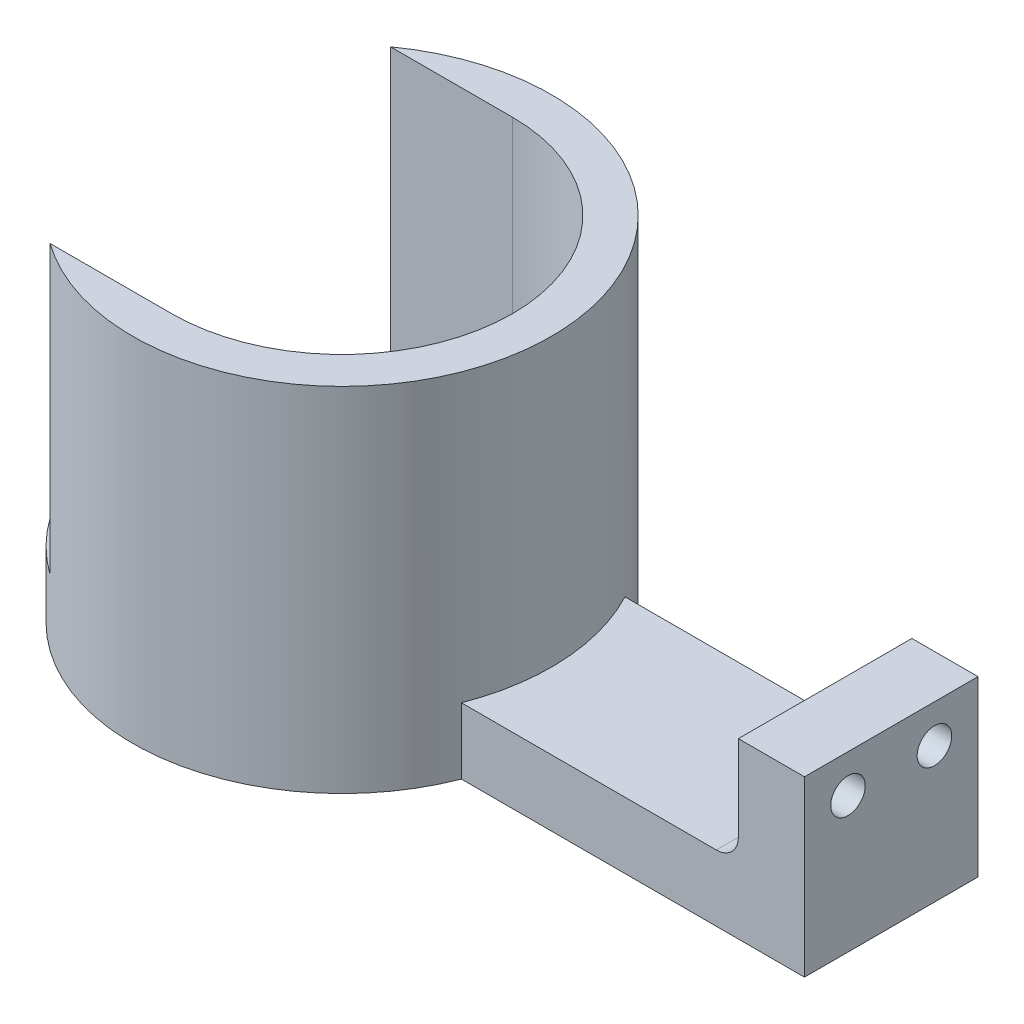
ISO-10303-21;
HEADER;
FILE_DESCRIPTION(('STEP AP214'),'2;1');
FILE_NAME('part.step','',(''),(''),'','','');
FILE_SCHEMA(('AUTOMOTIVE_DESIGN { 1 0 10303 214 1 1 1 1 }'));
ENDSEC;
DATA;
#1=APPLICATION_CONTEXT('core data for automotive mechanical design processes');
#2=APPLICATION_PROTOCOL_DEFINITION('international standard','automotive_design',2000,#1);
#3=PRODUCT_CONTEXT('',#1,'mechanical');
#4=PRODUCT('Part','Part','',(#3));
#5=PRODUCT_RELATED_PRODUCT_CATEGORY('part','',(#4));
#6=PRODUCT_DEFINITION_FORMATION('','',#4);
#7=PRODUCT_DEFINITION_CONTEXT('part definition',#1,'design');
#8=PRODUCT_DEFINITION('design','',#6,#7);
#9=PRODUCT_DEFINITION_SHAPE('','',#8);
#10=(LENGTH_UNIT() NAMED_UNIT(*) SI_UNIT(.MILLI.,.METRE.));
#11=(NAMED_UNIT(*) PLANE_ANGLE_UNIT() SI_UNIT($,.RADIAN.));
#12=(NAMED_UNIT(*) SI_UNIT($,.STERADIAN.) SOLID_ANGLE_UNIT());
#13=UNCERTAINTY_MEASURE_WITH_UNIT(LENGTH_MEASURE(1.E-05),#10,'distance_accuracy_value','');
#14=(GEOMETRIC_REPRESENTATION_CONTEXT(3) GLOBAL_UNCERTAINTY_ASSIGNED_CONTEXT((#13)) GLOBAL_UNIT_ASSIGNED_CONTEXT((#10,
#11,#12)) REPRESENTATION_CONTEXT('',''));
#15=CARTESIAN_POINT('',(0.,0.,0.));
#16=DIRECTION('',(0.,0.,1.));
#17=DIRECTION('',(1.,0.,0.));
#18=AXIS2_PLACEMENT_3D('',#15,#16,#17);
#19=CARTESIAN_POINT('',(0.,15.24,0.));
#20=DIRECTION('',(0.,1.,0.));
#21=DIRECTION('',(0.,0.,1.));
#22=AXIS2_PLACEMENT_3D('',#19,#20,#21);
#23=PLANE('',#22);
#24=DIRECTION('',(1.,0.,0.));
#25=VECTOR('',#24,1.);
#26=CARTESIAN_POINT('',(0.,15.24,-22.5127223135616));
#27=LINE('',#26,#25);
#28=CARTESIAN_POINT('',(42.6872924186164,15.24,-22.5127223135616));
#29=VERTEX_POINT('',#28);
#30=CARTESIAN_POINT('',(103.737292492616,15.24,-22.5127223135616));
#31=VERTEX_POINT('',#30);
#32=EDGE_CURVE('E225',#29,#31,#27,.T.);
#33=ORIENTED_EDGE('',*,*,#32,.F.);
#34=CARTESIAN_POINT('',(0.,15.24,0.));
#35=DIRECTION('',(0.,1.,0.));
#36=DIRECTION('',(0.,0.,1.));
#37=AXIS2_PLACEMENT_3D('',#34,#35,#36);
#38=CIRCLE('',#37,48.26);
#39=CARTESIAN_POINT('',(44.9802480997759,15.24,17.4872776864384));
#40=VERTEX_POINT('',#39);
#41=EDGE_CURVE('E158',#40,#29,#38,.T.);
#42=ORIENTED_EDGE('',*,*,#41,.F.);
#43=DIRECTION('',(1.,0.,0.));
#44=VECTOR('',#43,1.);
#45=CARTESIAN_POINT('',(0.,15.24,17.4872776864384));
#46=LINE('',#45,#44);
#47=CARTESIAN_POINT('',(103.737292492616,15.24,17.4872776864384));
#48=VERTEX_POINT('',#47);
#49=EDGE_CURVE('E221',#40,#48,#46,.T.);
#50=ORIENTED_EDGE('',*,*,#49,.T.);
#51=DIRECTION('',(0.,0.,-1.));
#52=VECTOR('',#51,1.);
#53=CARTESIAN_POINT('',(103.737292492616,15.24,-22.5127223135616));
#54=LINE('',#53,#52);
#55=EDGE_CURVE('E260',#48,#31,#54,.T.);
#56=ORIENTED_EDGE('',*,*,#55,.T.);
#57=EDGE_LOOP('',(#33,#42,#50,#56));
#58=FACE_BOUND('',#57,.T.);
#59=ADVANCED_FACE('F41',(#58),#23,.T.);
#60=DIRECTION('',(-1.,0.,0.));
#61=VECTOR('',#60,1.);
#62=CARTESIAN_POINT('',(0.,15.24,-39.248127244));
#63=LINE('',#62,#61);
#64=CARTESIAN_POINT('',(0.,15.24,-39.248127244));
#65=VERTEX_POINT('',#64);
#66=CARTESIAN_POINT('',(-28.0822382982337,15.24,-39.248127244));
#67=VERTEX_POINT('',#66);
#68=EDGE_CURVE('E162',#65,#67,#63,.T.);
#69=ORIENTED_EDGE('',*,*,#68,.T.);
#70=CARTESIAN_POINT('',(0.,15.24,0.));
#71=DIRECTION('',(0.,1.,0.));
#72=DIRECTION('',(0.,0.,1.));
#73=AXIS2_PLACEMENT_3D('',#70,#71,#72);
#74=CIRCLE('',#73,48.26);
#75=CARTESIAN_POINT('',(-28.0822382982338,15.24,39.248127244));
#76=VERTEX_POINT('',#75);
#77=EDGE_CURVE('E141',#67,#76,#74,.T.);
#78=ORIENTED_EDGE('',*,*,#77,.T.);
#79=DIRECTION('',(-1.,0.,0.));
#80=VECTOR('',#79,1.);
#81=CARTESIAN_POINT('',(0.,15.24,39.248127244));
#82=LINE('',#81,#80);
#83=CARTESIAN_POINT('',(0.,15.24,39.248127244));
#84=VERTEX_POINT('',#83);
#85=EDGE_CURVE('E62',#84,#76,#82,.T.);
#86=ORIENTED_EDGE('',*,*,#85,.F.);
#87=CARTESIAN_POINT('',(0.,15.24,0.));
#88=DIRECTION('',(0.,1.,0.));
#89=DIRECTION('',(0.,0.,1.));
#90=AXIS2_PLACEMENT_3D('',#87,#88,#89);
#91=CIRCLE('',#90,39.248127244);
#92=EDGE_CURVE('E57',#84,#65,#91,.T.);
#93=ORIENTED_EDGE('',*,*,#92,.T.);
#94=EDGE_LOOP('',(#69,#78,#86,#93));
#95=FACE_BOUND('',#94,.T.);
#96=CARTESIAN_POINT('',(0.,15.24,0.));
#97=DIRECTION('',(0.,1.,0.));
#98=DIRECTION('',(0.,0.,1.));
#99=AXIS2_PLACEMENT_3D('',#96,#97,#98);
#100=CIRCLE('',#99,26.56205);
#101=CARTESIAN_POINT('',(0.,15.24,-26.56205));
#102=VERTEX_POINT('',#101);
#103=EDGE_CURVE('E214',#102,#102,#100,.T.);
#104=ORIENTED_EDGE('',*,*,#103,.F.);
#105=EDGE_LOOP('',(#104));
#106=FACE_BOUND('',#105,.T.);
#107=ADVANCED_FACE('F310',(#95,#106),#23,.T.);
#108=CARTESIAN_POINT('',(0.,15.24,0.));
#109=DIRECTION('',(0.,-1.,0.));
#110=DIRECTION('',(0.,0.,-1.));
#111=AXIS2_PLACEMENT_3D('',#108,#109,#110);
#112=CYLINDRICAL_SURFACE('',#111,48.26);
#113=DIRECTION('',(0.,-1.,0.));
#114=VECTOR('',#113,1.);
#115=CARTESIAN_POINT('',(44.9802480997759,15.24,17.4872776864384));
#116=LINE('',#115,#114);
#117=CARTESIAN_POINT('',(44.9802480997759,0.,17.4872776864384));
#118=VERTEX_POINT('',#117);
#119=EDGE_CURVE('E256',#40,#118,#116,.T.);
#120=ORIENTED_EDGE('',*,*,#119,.F.);
#121=ORIENTED_EDGE('',*,*,#41,.T.);
#122=DIRECTION('',(0.,-1.,0.));
#123=VECTOR('',#122,1.);
#124=CARTESIAN_POINT('',(42.6872924186164,15.24,-22.5127223135616));
#125=LINE('',#124,#123);
#126=CARTESIAN_POINT('',(42.6872924186164,0.,-22.5127223135616));
#127=VERTEX_POINT('',#126);
#128=EDGE_CURVE('E229',#29,#127,#125,.T.);
#129=ORIENTED_EDGE('',*,*,#128,.T.);
#130=CARTESIAN_POINT('',(0.,0.,0.));
#131=DIRECTION('',(0.,1.,0.));
#132=DIRECTION('',(0.,0.,1.));
#133=AXIS2_PLACEMENT_3D('',#130,#131,#132);
#134=CIRCLE('',#133,48.26);
#135=EDGE_CURVE('E233',#127,#118,#134,.T.);
#136=ORIENTED_EDGE('',*,*,#135,.T.);
#137=EDGE_LOOP('',(#120,#121,#129,#136));
#138=FACE_BOUND('',#137,.T.);
#139=DIRECTION('',(0.,-1.,0.));
#140=VECTOR('',#139,1.);
#141=CARTESIAN_POINT('',(-28.0822382982338,81.28,39.248127244));
#142=LINE('',#141,#140);
#143=CARTESIAN_POINT('',(-28.0822382982338,81.28,39.248127244));
#144=VERTEX_POINT('',#143);
#145=EDGE_CURVE('E157',#144,#76,#142,.T.);
#146=ORIENTED_EDGE('',*,*,#145,.T.);
#147=ORIENTED_EDGE('',*,*,#77,.F.);
#148=DIRECTION('',(0.,-1.,0.));
#149=VECTOR('',#148,1.);
#150=CARTESIAN_POINT('',(-28.0822382982337,81.28,-39.248127244));
#151=LINE('',#150,#149);
#152=CARTESIAN_POINT('',(-28.0822382982337,81.28,-39.248127244));
#153=VERTEX_POINT('',#152);
#154=EDGE_CURVE('E139',#153,#67,#151,.T.);
#155=ORIENTED_EDGE('',*,*,#154,.F.);
#156=CARTESIAN_POINT('',(0.,81.28,0.));
#157=DIRECTION('',(0.,1.,0.));
#158=DIRECTION('',(0.,0.,1.));
#159=AXIS2_PLACEMENT_3D('',#156,#157,#158);
#160=CIRCLE('',#159,48.26);
#161=EDGE_CURVE('E124',#144,#153,#160,.T.);
#162=ORIENTED_EDGE('',*,*,#161,.F.);
#163=EDGE_LOOP('',(#146,#147,#155,#162));
#164=FACE_BOUND('',#163,.T.);
#165=ADVANCED_FACE('F140',(#138,#164),#112,.T.);
#166=CARTESIAN_POINT('',(0.,15.24,17.4872776864384));
#167=DIRECTION('',(0.,0.,-1.));
#168=DIRECTION('',(-1.,0.,0.));
#169=AXIS2_PLACEMENT_3D('',#166,#167,#168);
#170=PLANE('',#169);
#171=DIRECTION('',(1.,0.,0.));
#172=VECTOR('',#171,1.);
#173=CARTESIAN_POINT('',(0.,0.,17.4872776864384));
#174=LINE('',#173,#172);
#175=CARTESIAN_POINT('',(124.057292492616,0.,17.4872776864384));
#176=VERTEX_POINT('',#175);
#177=EDGE_CURVE('E237',#118,#176,#174,.T.);
#178=ORIENTED_EDGE('',*,*,#177,.T.);
#179=DIRECTION('',(0.,-1.,0.));
#180=VECTOR('',#179,1.);
#181=CARTESIAN_POINT('',(124.057292492616,15.24,17.4872776864384));
#182=LINE('',#181,#180);
#183=CARTESIAN_POINT('',(124.057292492616,40.,17.4872776864384));
#184=VERTEX_POINT('',#183);
#185=EDGE_CURVE('E253',#184,#176,#182,.T.);
#186=ORIENTED_EDGE('',*,*,#185,.F.);
#187=DIRECTION('',(-1.,0.,0.));
#188=VECTOR('',#187,1.);
#189=CARTESIAN_POINT('',(124.057292492616,40.,17.4872776864384));
#190=LINE('',#189,#188);
#191=CARTESIAN_POINT('',(108.817292492616,40.,17.4872776864384));
#192=VERTEX_POINT('',#191);
#193=EDGE_CURVE('E196',#184,#192,#190,.T.);
#194=ORIENTED_EDGE('',*,*,#193,.T.);
#195=DIRECTION('',(0.,-1.,0.));
#196=VECTOR('',#195,1.);
#197=CARTESIAN_POINT('',(108.817292492616,15.24,17.4872776864384));
#198=LINE('',#197,#196);
#199=CARTESIAN_POINT('',(108.817292492616,20.32,17.4872776864384));
#200=VERTEX_POINT('',#199);
#201=EDGE_CURVE('E192',#192,#200,#198,.T.);
#202=ORIENTED_EDGE('',*,*,#201,.T.);
#203=CARTESIAN_POINT('',(103.737292492616,20.32,17.4872776864384));
#204=DIRECTION('',(0.,0.,-1.));
#205=DIRECTION('',(-1.,0.,0.));
#206=AXIS2_PLACEMENT_3D('',#203,#204,#205);
#207=CIRCLE('',#206,5.07999999999999);
#208=EDGE_CURVE('E11',#200,#48,#207,.T.);
#209=ORIENTED_EDGE('',*,*,#208,.T.);
#210=ORIENTED_EDGE('',*,*,#49,.F.);
#211=ORIENTED_EDGE('',*,*,#119,.T.);
#212=EDGE_LOOP('',(#178,#186,#194,#202,#209,#210,#211));
#213=FACE_BOUND('',#212,.T.);
#214=ADVANCED_FACE('F283',(#213),#170,.F.);
#215=CARTESIAN_POINT('',(124.057292492616,15.24,0.));
#216=DIRECTION('',(1.,0.,0.));
#217=DIRECTION('',(0.,0.,-1.));
#218=AXIS2_PLACEMENT_3D('',#215,#216,#217);
#219=PLANE('',#218);
#220=CARTESIAN_POINT('',(124.057292492616,31.22176,7.44919768643836));
#221=DIRECTION('',(-1.,0.,0.));
#222=DIRECTION('',(0.,0.,1.));
#223=AXIS2_PLACEMENT_3D('',#220,#221,#222);
#224=CIRCLE('',#223,3.9773733);
#225=CARTESIAN_POINT('',(124.057292492616,31.22176,11.4265709864384));
#226=VERTEX_POINT('',#225);
#227=EDGE_CURVE('E176',#226,#226,#224,.T.);
#228=ORIENTED_EDGE('',*,*,#227,.T.);
#229=EDGE_LOOP('',(#228));
#230=FACE_BOUND('',#229,.T.);
#231=CARTESIAN_POINT('',(124.057292492616,31.22176,-12.4746423135616));
#232=DIRECTION('',(-1.,0.,0.));
#233=DIRECTION('',(0.,0.,1.));
#234=AXIS2_PLACEMENT_3D('',#231,#232,#233);
#235=CIRCLE('',#234,3.985133);
#236=CARTESIAN_POINT('',(124.057292492616,31.22176,-8.48950931356164));
#237=VERTEX_POINT('',#236);
#238=EDGE_CURVE('E185',#237,#237,#235,.T.);
#239=ORIENTED_EDGE('',*,*,#238,.T.);
#240=EDGE_LOOP('',(#239));
#241=FACE_BOUND('',#240,.T.);
#242=DIRECTION('',(0.,0.,1.));
#243=VECTOR('',#242,1.);
#244=CARTESIAN_POINT('',(124.057292492616,0.,0.));
#245=LINE('',#244,#243);
#246=CARTESIAN_POINT('',(124.057292492616,0.,-22.5127223135616));
#247=VERTEX_POINT('',#246);
#248=EDGE_CURVE('E241',#247,#176,#245,.T.);
#249=ORIENTED_EDGE('',*,*,#248,.F.);
#250=DIRECTION('',(0.,-1.,0.));
#251=VECTOR('',#250,1.);
#252=CARTESIAN_POINT('',(124.057292492616,15.24,-22.5127223135616));
#253=LINE('',#252,#251);
#254=CARTESIAN_POINT('',(124.057292492616,40.,-22.5127223135616));
#255=VERTEX_POINT('',#254);
#256=EDGE_CURVE('E250',#255,#247,#253,.T.);
#257=ORIENTED_EDGE('',*,*,#256,.F.);
#258=DIRECTION('',(0.,0.,-1.));
#259=VECTOR('',#258,1.);
#260=CARTESIAN_POINT('',(124.057292492616,40.,46.5615824932605));
#261=LINE('',#260,#259);
#262=EDGE_CURVE('E197',#184,#255,#261,.T.);
#263=ORIENTED_EDGE('',*,*,#262,.F.);
#264=ORIENTED_EDGE('',*,*,#185,.T.);
#265=EDGE_LOOP('',(#249,#257,#263,#264));
#266=FACE_BOUND('',#265,.T.);
#267=ADVANCED_FACE('F293',(#230,#241,#266),#219,.T.);
#268=CARTESIAN_POINT('',(0.,15.24,0.));
#269=DIRECTION('',(0.,-1.,0.));
#270=DIRECTION('',(0.,0.,-1.));
#271=AXIS2_PLACEMENT_3D('',#268,#269,#270);
#272=CYLINDRICAL_SURFACE('',#271,26.56205);
#273=CARTESIAN_POINT('',(0.,0.,0.));
#274=DIRECTION('',(0.,1.,0.));
#275=DIRECTION('',(0.,0.,1.));
#276=AXIS2_PLACEMENT_3D('',#273,#274,#275);
#277=CIRCLE('',#276,26.56205);
#278=CARTESIAN_POINT('',(0.,0.,-26.56205));
#279=VERTEX_POINT('',#278);
#280=EDGE_CURVE('E200',#279,#279,#277,.T.);
#281=CARTESIAN_POINT('',(0.,15.24,-26.56205));
#282=CARTESIAN_POINT('',(0.,15.08125,-26.56205));
#283=CARTESIAN_POINT('',(0.,14.9225,-26.56205));
#284=CARTESIAN_POINT('',(0.,14.605,-26.56205));
#285=CARTESIAN_POINT('',(0.,14.44625,-26.56205));
#286=CARTESIAN_POINT('',(0.,14.12875,-26.56205));
#287=CARTESIAN_POINT('',(0.,13.97,-26.56205));
#288=CARTESIAN_POINT('',(0.,13.6525,-26.56205));
#289=CARTESIAN_POINT('',(0.,13.49375,-26.56205));
#290=CARTESIAN_POINT('',(0.,13.17625,-26.56205));
#291=CARTESIAN_POINT('',(0.,13.0175,-26.56205));
#292=CARTESIAN_POINT('',(0.,12.7,-26.56205));
#293=CARTESIAN_POINT('',(0.,12.54125,-26.56205));
#294=CARTESIAN_POINT('',(0.,12.22375,-26.56205));
#295=CARTESIAN_POINT('',(0.,12.065,-26.56205));
#296=CARTESIAN_POINT('',(0.,11.7475,-26.56205));
#297=CARTESIAN_POINT('',(0.,11.58875,-26.56205));
#298=CARTESIAN_POINT('',(0.,11.27125,-26.56205));
#299=CARTESIAN_POINT('',(0.,11.1125,-26.56205));
#300=CARTESIAN_POINT('',(0.,10.795,-26.56205));
#301=CARTESIAN_POINT('',(0.,10.63625,-26.56205));
#302=CARTESIAN_POINT('',(0.,10.31875,-26.56205));
#303=CARTESIAN_POINT('',(0.,10.16,-26.56205));
#304=CARTESIAN_POINT('',(0.,9.8425,-26.56205));
#305=CARTESIAN_POINT('',(0.,9.68375,-26.56205));
#306=CARTESIAN_POINT('',(0.,9.36625,-26.56205));
#307=CARTESIAN_POINT('',(0.,9.2075,-26.56205));
#308=CARTESIAN_POINT('',(0.,8.89,-26.56205));
#309=CARTESIAN_POINT('',(0.,8.73125,-26.56205));
#310=CARTESIAN_POINT('',(0.,8.41375,-26.56205));
#311=CARTESIAN_POINT('',(0.,8.255,-26.56205));
#312=CARTESIAN_POINT('',(0.,7.9375,-26.56205));
#313=CARTESIAN_POINT('',(0.,7.77875,-26.56205));
#314=CARTESIAN_POINT('',(0.,7.46125,-26.56205));
#315=CARTESIAN_POINT('',(0.,7.3025,-26.56205));
#316=CARTESIAN_POINT('',(0.,6.985,-26.56205));
#317=CARTESIAN_POINT('',(0.,6.82625,-26.56205));
#318=CARTESIAN_POINT('',(0.,6.50875,-26.56205));
#319=CARTESIAN_POINT('',(0.,6.35,-26.56205));
#320=CARTESIAN_POINT('',(0.,6.0325,-26.56205));
#321=CARTESIAN_POINT('',(0.,5.87375,-26.56205));
#322=CARTESIAN_POINT('',(0.,5.55625,-26.56205));
#323=CARTESIAN_POINT('',(0.,5.3975,-26.56205));
#324=CARTESIAN_POINT('',(0.,5.08,-26.56205));
#325=CARTESIAN_POINT('',(0.,4.92125,-26.56205));
#326=CARTESIAN_POINT('',(0.,4.60375,-26.56205));
#327=CARTESIAN_POINT('',(0.,4.445,-26.56205));
#328=CARTESIAN_POINT('',(0.,4.1275,-26.56205));
#329=CARTESIAN_POINT('',(0.,3.96875,-26.56205));
#330=CARTESIAN_POINT('',(0.,3.65125,-26.56205));
#331=CARTESIAN_POINT('',(0.,3.4925,-26.56205));
#332=CARTESIAN_POINT('',(0.,3.175,-26.56205));
#333=CARTESIAN_POINT('',(0.,3.01625,-26.56205));
#334=CARTESIAN_POINT('',(0.,2.69875,-26.56205));
#335=CARTESIAN_POINT('',(0.,2.54,-26.56205));
#336=CARTESIAN_POINT('',(0.,2.2225,-26.56205));
#337=CARTESIAN_POINT('',(0.,2.06375,-26.56205));
#338=CARTESIAN_POINT('',(0.,1.74625,-26.56205));
#339=CARTESIAN_POINT('',(0.,1.5875,-26.56205));
#340=CARTESIAN_POINT('',(0.,1.27,-26.56205));
#341=CARTESIAN_POINT('',(0.,1.11125,-26.56205));
#342=CARTESIAN_POINT('',(0.,0.79375,-26.56205));
#343=CARTESIAN_POINT('',(0.,0.634999999999999,-26.56205));
#344=CARTESIAN_POINT('',(0.,0.3175,-26.56205));
#345=CARTESIAN_POINT('',(0.,0.15875,-26.56205));
#346=CARTESIAN_POINT('',(0.,0.,-26.56205));
#347=B_SPLINE_CURVE_WITH_KNOTS('',3,(#281,#282,#283,#284,#285,#286,#287,#288,#289,#290,#291,
#292,#293,#294,#295,#296,#297,#298,#299,#300,#301,#302,#303,#304,#305,#306,#307,#308,#309,#310,
#311,#312,#313,#314,#315,#316,#317,#318,#319,#320,#321,#322,#323,#324,#325,#326,#327,#328,#329,
#330,#331,#332,#333,#334,#335,#336,#337,#338,#339,#340,#341,#342,#343,#344,#345,#346),
.UNSPECIFIED.,.F.,.F.,(4,2,2,2,2,2,2,2,2,2,2,2,2,2,2,2,2,2,2,2,2,2,2,2,2,2,2,2,2,2,2,2,4),(0.,
0.476249999999999,0.952499999999998,1.42875,1.905,2.38125,2.8575,3.33375,3.81,4.28625,4.7625,
5.23875,5.715,6.19125,6.6675,7.14375,7.62,8.09625,8.5725,9.04875,9.525,10.00125,10.4775,
10.95375,11.43,11.90625,12.3825,12.85875,13.335,13.81125,14.2875,14.76375,15.24),.UNSPECIFIED.);
#348=EDGE_CURVE('BSEAM318',#102,#279,#347,.T.);
#349=ORIENTED_EDGE('',*,*,#103,.T.);
#350=ORIENTED_EDGE('',*,*,#280,.F.);
#351=ORIENTED_EDGE('',*,*,#348,.T.);
#352=ORIENTED_EDGE('',*,*,#348,.F.);
#353=EDGE_LOOP('',(#349,#351,#350,#352));
#354=FACE_BOUND('',#353,.T.);
#355=ADVANCED_FACE('F318',(#354),#272,.F.);
#356=CARTESIAN_POINT('',(0.,15.24,-22.5127223135616));
#357=DIRECTION('',(0.,0.,-1.));
#358=DIRECTION('',(-1.,0.,0.));
#359=AXIS2_PLACEMENT_3D('',#356,#357,#358);
#360=PLANE('',#359);
#361=DIRECTION('',(1.,0.,0.));
#362=VECTOR('',#361,1.);
#363=CARTESIAN_POINT('',(0.,0.,-22.5127223135616));
#364=LINE('',#363,#362);
#365=EDGE_CURVE('E218',#127,#247,#364,.T.);
#366=ORIENTED_EDGE('',*,*,#365,.F.);
#367=ORIENTED_EDGE('',*,*,#128,.F.);
#368=ORIENTED_EDGE('',*,*,#32,.T.);
#369=CARTESIAN_POINT('',(103.737292492616,20.32,-22.5127223135616));
#370=DIRECTION('',(0.,0.,-1.));
#371=DIRECTION('',(-1.,0.,0.));
#372=AXIS2_PLACEMENT_3D('',#369,#370,#371);
#373=CIRCLE('',#372,5.07999999999999);
#374=CARTESIAN_POINT('',(108.817292492616,20.32,-22.5127223135616));
#375=VERTEX_POINT('',#374);
#376=EDGE_CURVE('E50',#31,#375,#373,.F.);
#377=ORIENTED_EDGE('',*,*,#376,.T.);
#378=DIRECTION('',(0.,1.,0.));
#379=VECTOR('',#378,1.);
#380=CARTESIAN_POINT('',(108.817292492616,15.24,-22.5127223135616));
#381=LINE('',#380,#379);
#382=CARTESIAN_POINT('',(108.817292492616,40.,-22.5127223135616));
#383=VERTEX_POINT('',#382);
#384=EDGE_CURVE('E180',#375,#383,#381,.T.);
#385=ORIENTED_EDGE('',*,*,#384,.T.);
#386=DIRECTION('',(1.,0.,0.));
#387=VECTOR('',#386,1.);
#388=CARTESIAN_POINT('',(124.057292492616,40.,-22.5127223135616));
#389=LINE('',#388,#387);
#390=EDGE_CURVE('E203',#383,#255,#389,.T.);
#391=ORIENTED_EDGE('',*,*,#390,.T.);
#392=ORIENTED_EDGE('',*,*,#256,.T.);
#393=EDGE_LOOP('',(#366,#367,#368,#377,#385,#391,#392));
#394=FACE_BOUND('',#393,.T.);
#395=ADVANCED_FACE('F270',(#394),#360,.T.);
#396=CARTESIAN_POINT('',(0.,0.,0.));
#397=DIRECTION('',(0.,1.,0.));
#398=DIRECTION('',(0.,0.,1.));
#399=AXIS2_PLACEMENT_3D('',#396,#397,#398);
#400=PLANE('',#399);
#401=ORIENTED_EDGE('',*,*,#280,.T.);
#402=EDGE_LOOP('',(#401));
#403=FACE_BOUND('',#402,.T.);
#404=ORIENTED_EDGE('',*,*,#135,.F.);
#405=ORIENTED_EDGE('',*,*,#365,.T.);
#406=ORIENTED_EDGE('',*,*,#248,.T.);
#407=ORIENTED_EDGE('',*,*,#177,.F.);
#408=EDGE_LOOP('',(#404,#405,#406,#407));
#409=FACE_BOUND('',#408,.T.);
#410=ADVANCED_FACE('F291',(#403,#409),#400,.F.);
#411=CARTESIAN_POINT('',(124.057292492616,40.,46.5615824932605));
#412=DIRECTION('',(0.,1.,0.));
#413=DIRECTION('',(0.,0.,1.));
#414=AXIS2_PLACEMENT_3D('',#411,#412,#413);
#415=PLANE('',#414);
#416=ORIENTED_EDGE('',*,*,#193,.F.);
#417=ORIENTED_EDGE('',*,*,#262,.T.);
#418=ORIENTED_EDGE('',*,*,#390,.F.);
#419=DIRECTION('',(0.,0.,-1.));
#420=VECTOR('',#419,1.);
#421=CARTESIAN_POINT('',(108.817292492616,40.,46.5615824932605));
#422=LINE('',#421,#420);
#423=EDGE_CURVE('E207',#192,#383,#422,.T.);
#424=ORIENTED_EDGE('',*,*,#423,.F.);
#425=EDGE_LOOP('',(#416,#417,#418,#424));
#426=FACE_BOUND('',#425,.T.);
#427=ADVANCED_FACE('F296',(#426),#415,.T.);
#428=CARTESIAN_POINT('',(108.817292492616,15.24,46.5615824932605));
#429=DIRECTION('',(-1.,0.,0.));
#430=DIRECTION('',(0.,0.,1.));
#431=AXIS2_PLACEMENT_3D('',#428,#429,#430);
#432=PLANE('',#431);
#433=CARTESIAN_POINT('',(108.817292492616,31.22176,7.44919768643836));
#434=DIRECTION('',(-1.,0.,0.));
#435=DIRECTION('',(0.,0.,1.));
#436=AXIS2_PLACEMENT_3D('',#433,#434,#435);
#437=CIRCLE('',#436,3.9773733);
#438=CARTESIAN_POINT('',(108.817292492616,31.22176,11.4265709864384));
#439=VERTEX_POINT('',#438);
#440=EDGE_CURVE('E181',#439,#439,#437,.T.);
#441=ORIENTED_EDGE('',*,*,#440,.F.);
#442=EDGE_LOOP('',(#441));
#443=FACE_BOUND('',#442,.T.);
#444=CARTESIAN_POINT('',(108.817292492616,31.22176,-12.4746423135616));
#445=DIRECTION('',(-1.,0.,0.));
#446=DIRECTION('',(0.,0.,1.));
#447=AXIS2_PLACEMENT_3D('',#444,#445,#446);
#448=CIRCLE('',#447,3.985133);
#449=CARTESIAN_POINT('',(108.817292492616,31.22176,-8.48950931356164));
#450=VERTEX_POINT('',#449);
#451=EDGE_CURVE('E145',#450,#450,#448,.T.);
#452=ORIENTED_EDGE('',*,*,#451,.F.);
#453=EDGE_LOOP('',(#452));
#454=FACE_BOUND('',#453,.T.);
#455=ORIENTED_EDGE('',*,*,#384,.F.);
#456=DIRECTION('',(0.,0.,-1.));
#457=VECTOR('',#456,1.);
#458=CARTESIAN_POINT('',(108.817292492616,20.32,17.4872776864384));
#459=LINE('',#458,#457);
#460=EDGE_CURVE('E264',#375,#200,#459,.F.);
#461=ORIENTED_EDGE('',*,*,#460,.T.);
#462=ORIENTED_EDGE('',*,*,#201,.F.);
#463=ORIENTED_EDGE('',*,*,#423,.T.);
#464=EDGE_LOOP('',(#455,#461,#462,#463));
#465=FACE_BOUND('',#464,.T.);
#466=ADVANCED_FACE('F276',(#443,#454,#465),#432,.T.);
#467=CARTESIAN_POINT('',(124.057292492616,31.22176,-12.4746423135616));
#468=DIRECTION('',(-1.,0.,0.));
#469=DIRECTION('',(0.,0.,1.));
#470=AXIS2_PLACEMENT_3D('',#467,#468,#469);
#471=CYLINDRICAL_SURFACE('',#470,3.985133);
#472=ORIENTED_EDGE('',*,*,#238,.F.);
#473=EDGE_LOOP('',(#472));
#474=FACE_BOUND('',#473,.T.);
#475=ORIENTED_EDGE('',*,*,#451,.T.);
#476=EDGE_LOOP('',(#475));
#477=FACE_BOUND('',#476,.T.);
#478=ADVANCED_FACE('F303',(#474,#477),#471,.F.);
#479=CARTESIAN_POINT('',(124.057292492616,31.22176,7.44919768643836));
#480=DIRECTION('',(-1.,0.,0.));
#481=DIRECTION('',(0.,0.,1.));
#482=AXIS2_PLACEMENT_3D('',#479,#480,#481);
#483=CYLINDRICAL_SURFACE('',#482,3.9773733);
#484=ORIENTED_EDGE('',*,*,#227,.F.);
#485=EDGE_LOOP('',(#484));
#486=FACE_BOUND('',#485,.T.);
#487=ORIENTED_EDGE('',*,*,#440,.T.);
#488=EDGE_LOOP('',(#487));
#489=FACE_BOUND('',#488,.T.);
#490=ADVANCED_FACE('F367',(#486,#489),#483,.F.);
#491=CARTESIAN_POINT('',(103.737292492616,20.32,0.));
#492=DIRECTION('',(0.,0.,1.));
#493=DIRECTION('',(1.,0.,0.));
#494=AXIS2_PLACEMENT_3D('',#491,#492,#493);
#495=CYLINDRICAL_SURFACE('',#494,5.07999999999999);
#496=ORIENTED_EDGE('',*,*,#208,.F.);
#497=ORIENTED_EDGE('',*,*,#460,.F.);
#498=ORIENTED_EDGE('',*,*,#376,.F.);
#499=ORIENTED_EDGE('',*,*,#55,.F.);
#500=EDGE_LOOP('',(#496,#497,#498,#499));
#501=FACE_BOUND('',#500,.T.);
#502=ADVANCED_FACE('F43',(#501),#495,.F.);
#503=CARTESIAN_POINT('',(0.,81.28,-39.248127244));
#504=DIRECTION('',(0.,0.,1.));
#505=DIRECTION('',(1.,0.,0.));
#506=AXIS2_PLACEMENT_3D('',#503,#504,#505);
#507=PLANE('',#506);
#508=ORIENTED_EDGE('',*,*,#68,.F.);
#509=DIRECTION('',(0.,-1.,0.));
#510=VECTOR('',#509,1.);
#511=CARTESIAN_POINT('',(0.,81.28,-39.248127244));
#512=LINE('',#511,#510);
#513=CARTESIAN_POINT('',(0.,81.28,-39.248127244));
#514=VERTEX_POINT('',#513);
#515=EDGE_CURVE('E146',#514,#65,#512,.T.);
#516=ORIENTED_EDGE('',*,*,#515,.F.);
#517=DIRECTION('',(-1.,0.,0.));
#518=VECTOR('',#517,1.);
#519=CARTESIAN_POINT('',(0.,81.28,-39.248127244));
#520=LINE('',#519,#518);
#521=EDGE_CURVE('E129',#514,#153,#520,.T.);
#522=ORIENTED_EDGE('',*,*,#521,.T.);
#523=ORIENTED_EDGE('',*,*,#154,.T.);
#524=EDGE_LOOP('',(#508,#516,#522,#523));
#525=FACE_BOUND('',#524,.T.);
#526=ADVANCED_FACE('F148',(#525),#507,.T.);
#527=CARTESIAN_POINT('',(0.,81.28,0.));
#528=DIRECTION('',(0.,-1.,0.));
#529=DIRECTION('',(0.,0.,-1.));
#530=AXIS2_PLACEMENT_3D('',#527,#528,#529);
#531=CYLINDRICAL_SURFACE('',#530,39.248127244);
#532=ORIENTED_EDGE('',*,*,#92,.F.);
#533=DIRECTION('',(0.,-1.,0.));
#534=VECTOR('',#533,1.);
#535=CARTESIAN_POINT('',(0.,81.28,39.248127244));
#536=LINE('',#535,#534);
#537=CARTESIAN_POINT('',(0.,81.28,39.248127244));
#538=VERTEX_POINT('',#537);
#539=EDGE_CURVE('E171',#538,#84,#536,.T.);
#540=ORIENTED_EDGE('',*,*,#539,.F.);
#541=CARTESIAN_POINT('',(0.,81.28,0.));
#542=DIRECTION('',(0.,1.,0.));
#543=DIRECTION('',(0.,0.,1.));
#544=AXIS2_PLACEMENT_3D('',#541,#542,#543);
#545=CIRCLE('',#544,39.248127244);
#546=EDGE_CURVE('E150',#538,#514,#545,.T.);
#547=ORIENTED_EDGE('',*,*,#546,.T.);
#548=ORIENTED_EDGE('',*,*,#515,.T.);
#549=EDGE_LOOP('',(#532,#540,#547,#548));
#550=FACE_BOUND('',#549,.T.);
#551=ADVANCED_FACE('F438',(#550),#531,.F.);
#552=CARTESIAN_POINT('',(0.,81.28,39.248127244));
#553=DIRECTION('',(0.,0.,1.));
#554=DIRECTION('',(1.,0.,0.));
#555=AXIS2_PLACEMENT_3D('',#552,#553,#554);
#556=PLANE('',#555);
#557=ORIENTED_EDGE('',*,*,#85,.T.);
#558=ORIENTED_EDGE('',*,*,#145,.F.);
#559=DIRECTION('',(-1.,0.,0.));
#560=VECTOR('',#559,1.);
#561=CARTESIAN_POINT('',(0.,81.28,39.248127244));
#562=LINE('',#561,#560);
#563=EDGE_CURVE('E132',#538,#144,#562,.T.);
#564=ORIENTED_EDGE('',*,*,#563,.F.);
#565=ORIENTED_EDGE('',*,*,#539,.T.);
#566=EDGE_LOOP('',(#557,#558,#564,#565));
#567=FACE_BOUND('',#566,.T.);
#568=ADVANCED_FACE('F446',(#567),#556,.F.);
#569=CARTESIAN_POINT('',(0.,81.28,0.));
#570=DIRECTION('',(0.,1.,0.));
#571=DIRECTION('',(0.,0.,1.));
#572=AXIS2_PLACEMENT_3D('',#569,#570,#571);
#573=PLANE('',#572);
#574=ORIENTED_EDGE('',*,*,#161,.T.);
#575=ORIENTED_EDGE('',*,*,#521,.F.);
#576=ORIENTED_EDGE('',*,*,#546,.F.);
#577=ORIENTED_EDGE('',*,*,#563,.T.);
#578=EDGE_LOOP('',(#574,#575,#576,#577));
#579=FACE_BOUND('',#578,.T.);
#580=ADVANCED_FACE('F126',(#579),#573,.T.);
#581=CLOSED_SHELL('',(#59,#107,#165,#214,#267,#355,#395,#410,#427,#466,#478,#490,#502,#526,#551,
#568,#580));
#582=MANIFOLD_SOLID_BREP('B2',#581);
#583=ADVANCED_BREP_SHAPE_REPRESENTATION('',(#18,#582),#14);
#584=SHAPE_DEFINITION_REPRESENTATION(#9,#583);
ENDSEC;
END-ISO-10303-21;
